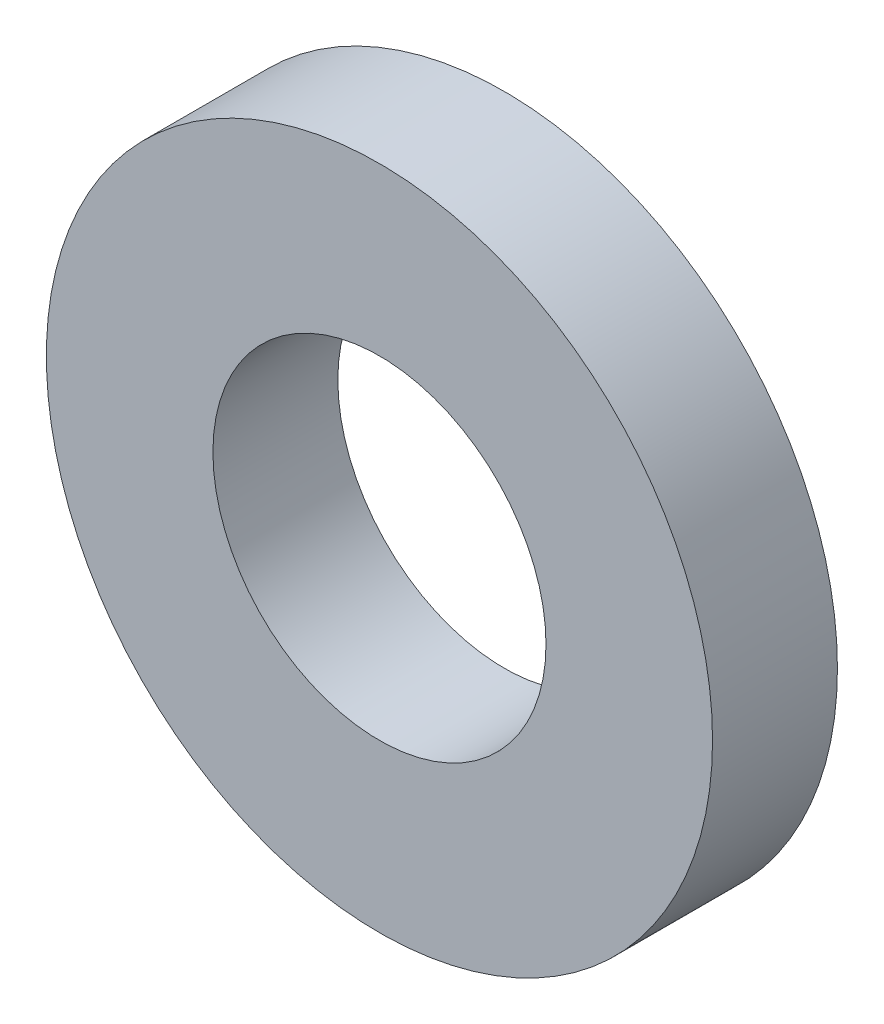
ISO-10303-21;
HEADER;
FILE_DESCRIPTION(('STEP AP214'),'2;1');
FILE_NAME('part.step','',(''),(''),'','','');
FILE_SCHEMA(('AUTOMOTIVE_DESIGN { 1 0 10303 214 1 1 1 1 }'));
ENDSEC;
DATA;
#1=APPLICATION_CONTEXT('core data for automotive mechanical design processes');
#2=APPLICATION_PROTOCOL_DEFINITION('international standard','automotive_design',2000,#1);
#3=PRODUCT_CONTEXT('',#1,'mechanical');
#4=PRODUCT('Part','Part','',(#3));
#5=PRODUCT_RELATED_PRODUCT_CATEGORY('part','',(#4));
#6=PRODUCT_DEFINITION_FORMATION('','',#4);
#7=PRODUCT_DEFINITION_CONTEXT('part definition',#1,'design');
#8=PRODUCT_DEFINITION('design','',#6,#7);
#9=PRODUCT_DEFINITION_SHAPE('','',#8);
#10=(LENGTH_UNIT() NAMED_UNIT(*) SI_UNIT(.MILLI.,.METRE.));
#11=(NAMED_UNIT(*) PLANE_ANGLE_UNIT() SI_UNIT($,.RADIAN.));
#12=(NAMED_UNIT(*) SI_UNIT($,.STERADIAN.) SOLID_ANGLE_UNIT());
#13=UNCERTAINTY_MEASURE_WITH_UNIT(LENGTH_MEASURE(1.E-05),#10,'distance_accuracy_value','');
#14=(GEOMETRIC_REPRESENTATION_CONTEXT(3) GLOBAL_UNCERTAINTY_ASSIGNED_CONTEXT((#13)) GLOBAL_UNIT_ASSIGNED_CONTEXT((#10,
#11,#12)) REPRESENTATION_CONTEXT('',''));
#15=CARTESIAN_POINT('',(0.,0.,0.));
#16=DIRECTION('',(0.,0.,1.));
#17=DIRECTION('',(1.,0.,0.));
#18=AXIS2_PLACEMENT_3D('',#15,#16,#17);
#19=CARTESIAN_POINT('',(0.,0.,2.38125));
#20=DIRECTION('',(0.,0.,1.));
#21=DIRECTION('',(1.,0.,0.));
#22=AXIS2_PLACEMENT_3D('',#19,#20,#21);
#23=PLANE('',#22);
#24=CARTESIAN_POINT('',(0.,0.,2.38125));
#25=DIRECTION('',(0.,0.,1.));
#26=DIRECTION('',(1.,0.,0.));
#27=AXIS2_PLACEMENT_3D('',#24,#25,#26);
#28=CIRCLE('',#27,12.7);
#29=CARTESIAN_POINT('',(12.7,0.,2.38125));
#30=VERTEX_POINT('',#29);
#31=EDGE_CURVE('E10',#30,#30,#28,.T.);
#32=ORIENTED_EDGE('',*,*,#31,.T.);
#33=EDGE_LOOP('',(#32));
#34=FACE_BOUND('',#33,.T.);
#35=CARTESIAN_POINT('',(0.,0.,2.38125));
#36=DIRECTION('',(0.,0.,1.));
#37=DIRECTION('',(1.,0.,0.));
#38=AXIS2_PLACEMENT_3D('',#35,#36,#37);
#39=CIRCLE('',#38,6.35);
#40=CARTESIAN_POINT('',(6.35,0.,2.38125));
#41=VERTEX_POINT('',#40);
#42=EDGE_CURVE('E50',#41,#41,#39,.T.);
#43=ORIENTED_EDGE('',*,*,#42,.F.);
#44=EDGE_LOOP('',(#43));
#45=FACE_BOUND('',#44,.T.);
#46=ADVANCED_FACE('F39',(#34,#45),#23,.T.);
#47=CARTESIAN_POINT('',(0.,0.,-2.38125));
#48=DIRECTION('',(0.,0.,1.));
#49=DIRECTION('',(1.,0.,0.));
#50=AXIS2_PLACEMENT_3D('',#47,#48,#49);
#51=PLANE('',#50);
#52=CARTESIAN_POINT('',(0.,0.,-2.38125));
#53=DIRECTION('',(0.,0.,1.));
#54=DIRECTION('',(1.,0.,0.));
#55=AXIS2_PLACEMENT_3D('',#52,#53,#54);
#56=CIRCLE('',#55,12.7);
#57=CARTESIAN_POINT('',(12.7,0.,-2.38125));
#58=VERTEX_POINT('',#57);
#59=EDGE_CURVE('E43',#58,#58,#56,.T.);
#60=ORIENTED_EDGE('',*,*,#59,.F.);
#61=EDGE_LOOP('',(#60));
#62=FACE_BOUND('',#61,.T.);
#63=CARTESIAN_POINT('',(0.,0.,-2.38125));
#64=DIRECTION('',(0.,0.,1.));
#65=DIRECTION('',(1.,0.,0.));
#66=AXIS2_PLACEMENT_3D('',#63,#64,#65);
#67=CIRCLE('',#66,6.35);
#68=CARTESIAN_POINT('',(6.35,0.,-2.38125));
#69=VERTEX_POINT('',#68);
#70=EDGE_CURVE('E52',#69,#69,#67,.T.);
#71=ORIENTED_EDGE('',*,*,#70,.T.);
#72=EDGE_LOOP('',(#71));
#73=FACE_BOUND('',#72,.T.);
#74=ADVANCED_FACE('F62',(#62,#73),#51,.F.);
#75=CARTESIAN_POINT('',(0.,0.,2.38125));
#76=DIRECTION('',(0.,0.,-1.));
#77=DIRECTION('',(-1.,0.,0.));
#78=AXIS2_PLACEMENT_3D('',#75,#76,#77);
#79=CYLINDRICAL_SURFACE('',#78,12.7);
#80=ORIENTED_EDGE('',*,*,#31,.F.);
#81=EDGE_LOOP('',(#80));
#82=FACE_BOUND('',#81,.T.);
#83=ORIENTED_EDGE('',*,*,#59,.T.);
#84=EDGE_LOOP('',(#83));
#85=FACE_BOUND('',#84,.T.);
#86=ADVANCED_FACE('F41',(#82,#85),#79,.T.);
#87=CARTESIAN_POINT('',(0.,0.,2.38125));
#88=DIRECTION('',(0.,0.,-1.));
#89=DIRECTION('',(-1.,0.,0.));
#90=AXIS2_PLACEMENT_3D('',#87,#88,#89);
#91=CYLINDRICAL_SURFACE('',#90,6.35);
#92=ORIENTED_EDGE('',*,*,#42,.T.);
#93=EDGE_LOOP('',(#92));
#94=FACE_BOUND('',#93,.T.);
#95=ORIENTED_EDGE('',*,*,#70,.F.);
#96=EDGE_LOOP('',(#95));
#97=FACE_BOUND('',#96,.T.);
#98=ADVANCED_FACE('F58',(#94,#97),#91,.F.);
#99=CLOSED_SHELL('',(#46,#74,#86,#98));
#100=MANIFOLD_SOLID_BREP('B2',#99);
#101=ADVANCED_BREP_SHAPE_REPRESENTATION('',(#18,#100),#14);
#102=SHAPE_DEFINITION_REPRESENTATION(#9,#101);
ENDSEC;
END-ISO-10303-21;
